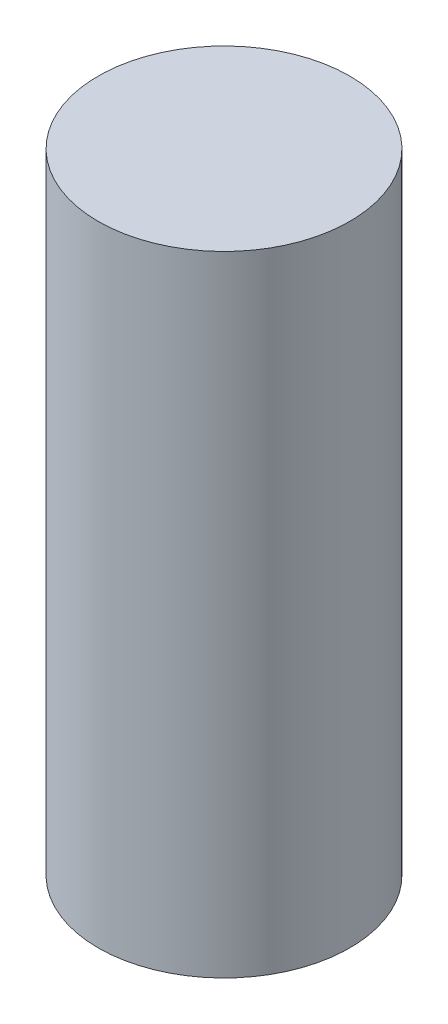
ISO-10303-21;
HEADER;
FILE_DESCRIPTION(('STEP AP214'),'2;1');
FILE_NAME('part.step','',(''),(''),'','','');
FILE_SCHEMA(('AUTOMOTIVE_DESIGN { 1 0 10303 214 1 1 1 1 }'));
ENDSEC;
DATA;
#1=APPLICATION_CONTEXT('core data for automotive mechanical design processes');
#2=APPLICATION_PROTOCOL_DEFINITION('international standard','automotive_design',2000,#1);
#3=PRODUCT_CONTEXT('',#1,'mechanical');
#4=PRODUCT('Part','Part','',(#3));
#5=PRODUCT_RELATED_PRODUCT_CATEGORY('part','',(#4));
#6=PRODUCT_DEFINITION_FORMATION('','',#4);
#7=PRODUCT_DEFINITION_CONTEXT('part definition',#1,'design');
#8=PRODUCT_DEFINITION('design','',#6,#7);
#9=PRODUCT_DEFINITION_SHAPE('','',#8);
#10=(LENGTH_UNIT() NAMED_UNIT(*) SI_UNIT(.MILLI.,.METRE.));
#11=(NAMED_UNIT(*) PLANE_ANGLE_UNIT() SI_UNIT($,.RADIAN.));
#12=(NAMED_UNIT(*) SI_UNIT($,.STERADIAN.) SOLID_ANGLE_UNIT());
#13=UNCERTAINTY_MEASURE_WITH_UNIT(LENGTH_MEASURE(1.E-05),#10,'distance_accuracy_value','');
#14=(GEOMETRIC_REPRESENTATION_CONTEXT(3) GLOBAL_UNCERTAINTY_ASSIGNED_CONTEXT((#13)) GLOBAL_UNIT_ASSIGNED_CONTEXT((#10,
#11,#12)) REPRESENTATION_CONTEXT('',''));
#15=CARTESIAN_POINT('',(0.,0.,0.));
#16=DIRECTION('',(0.,0.,1.));
#17=DIRECTION('',(1.,0.,0.));
#18=AXIS2_PLACEMENT_3D('',#15,#16,#17);
#19=CARTESIAN_POINT('',(0.,1500.,0.));
#20=DIRECTION('',(0.,-1.,0.));
#21=DIRECTION('',(0.,0.,-1.));
#22=AXIS2_PLACEMENT_3D('',#19,#20,#21);
#23=CYLINDRICAL_SURFACE('',#22,300.);
#24=CARTESIAN_POINT('',(0.,1500.,0.));
#25=DIRECTION('',(0.,1.,0.));
#26=DIRECTION('',(0.,0.,1.));
#27=AXIS2_PLACEMENT_3D('',#24,#25,#26);
#28=CIRCLE('',#27,300.);
#29=CARTESIAN_POINT('',(0.,1500.,300.));
#30=VERTEX_POINT('',#29);
#31=EDGE_CURVE('E10',#30,#30,#28,.T.);
#32=ORIENTED_EDGE('',*,*,#31,.F.);
#33=EDGE_LOOP('',(#32));
#34=FACE_BOUND('',#33,.T.);
#35=CARTESIAN_POINT('',(0.,0.,0.));
#36=DIRECTION('',(0.,1.,0.));
#37=DIRECTION('',(0.,0.,1.));
#38=AXIS2_PLACEMENT_3D('',#35,#36,#37);
#39=CIRCLE('',#38,300.);
#40=CARTESIAN_POINT('',(0.,0.,300.));
#41=VERTEX_POINT('',#40);
#42=EDGE_CURVE('E42',#41,#41,#39,.T.);
#43=ORIENTED_EDGE('',*,*,#42,.T.);
#44=EDGE_LOOP('',(#43));
#45=FACE_BOUND('',#44,.T.);
#46=ADVANCED_FACE('F39',(#34,#45),#23,.T.);
#47=CARTESIAN_POINT('',(0.,1500.,0.));
#48=DIRECTION('',(0.,1.,0.));
#49=DIRECTION('',(0.,0.,1.));
#50=AXIS2_PLACEMENT_3D('',#47,#48,#49);
#51=PLANE('',#50);
#52=ORIENTED_EDGE('',*,*,#31,.T.);
#53=EDGE_LOOP('',(#52));
#54=FACE_BOUND('',#53,.T.);
#55=ADVANCED_FACE('F54',(#54),#51,.T.);
#56=CARTESIAN_POINT('',(0.,0.,0.));
#57=DIRECTION('',(0.,1.,0.));
#58=DIRECTION('',(0.,0.,1.));
#59=AXIS2_PLACEMENT_3D('',#56,#57,#58);
#60=PLANE('',#59);
#61=ORIENTED_EDGE('',*,*,#42,.F.);
#62=EDGE_LOOP('',(#61));
#63=FACE_BOUND('',#62,.T.);
#64=ADVANCED_FACE('F52',(#63),#60,.F.);
#65=CLOSED_SHELL('',(#46,#55,#64));
#66=MANIFOLD_SOLID_BREP('B2',#65);
#67=ADVANCED_BREP_SHAPE_REPRESENTATION('',(#18,#66),#14);
#68=SHAPE_DEFINITION_REPRESENTATION(#9,#67);
ENDSEC;
END-ISO-10303-21;
